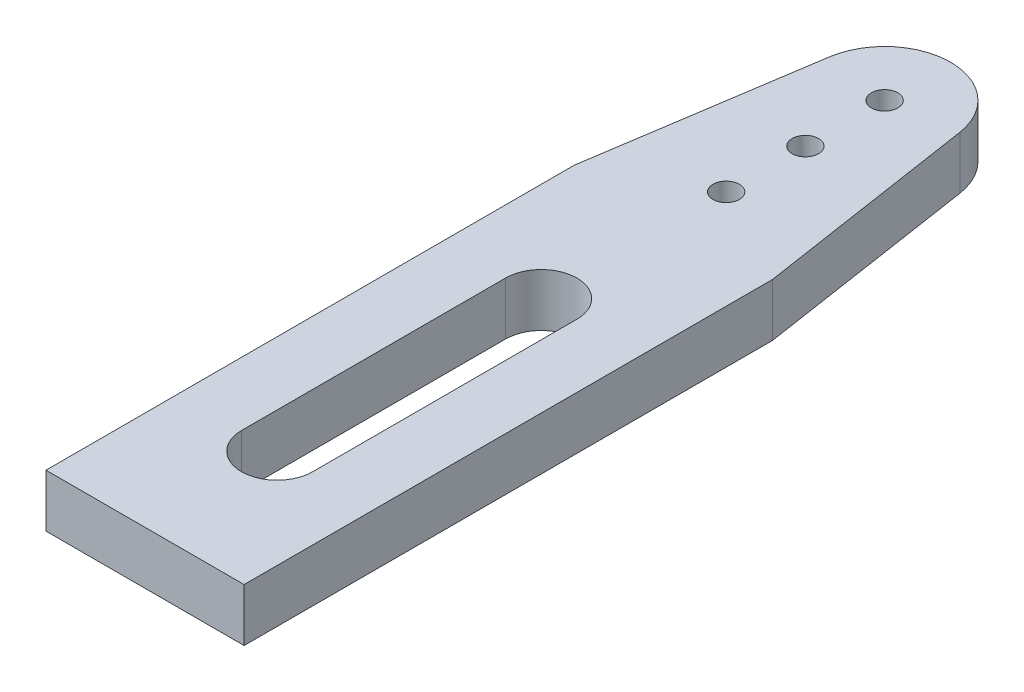
ISO-10303-21;
HEADER;
FILE_DESCRIPTION(('STEP AP214'),'2;1');
FILE_NAME('part.step','',(''),(''),'','','');
FILE_SCHEMA(('AUTOMOTIVE_DESIGN { 1 0 10303 214 1 1 1 1 }'));
ENDSEC;
DATA;
#1=APPLICATION_CONTEXT('core data for automotive mechanical design processes');
#2=APPLICATION_PROTOCOL_DEFINITION('international standard','automotive_design',2000,#1);
#3=PRODUCT_CONTEXT('',#1,'mechanical');
#4=PRODUCT('Part','Part','',(#3));
#5=PRODUCT_RELATED_PRODUCT_CATEGORY('part','',(#4));
#6=PRODUCT_DEFINITION_FORMATION('','',#4);
#7=PRODUCT_DEFINITION_CONTEXT('part definition',#1,'design');
#8=PRODUCT_DEFINITION('design','',#6,#7);
#9=PRODUCT_DEFINITION_SHAPE('','',#8);
#10=(LENGTH_UNIT() NAMED_UNIT(*) SI_UNIT(.MILLI.,.METRE.));
#11=(NAMED_UNIT(*) PLANE_ANGLE_UNIT() SI_UNIT($,.RADIAN.));
#12=(NAMED_UNIT(*) SI_UNIT($,.STERADIAN.) SOLID_ANGLE_UNIT());
#13=UNCERTAINTY_MEASURE_WITH_UNIT(LENGTH_MEASURE(1.E-05),#10,'distance_accuracy_value','');
#14=(GEOMETRIC_REPRESENTATION_CONTEXT(3) GLOBAL_UNCERTAINTY_ASSIGNED_CONTEXT((#13)) GLOBAL_UNIT_ASSIGNED_CONTEXT((#10,
#11,#12)) REPRESENTATION_CONTEXT('',''));
#15=CARTESIAN_POINT('',(0.,0.,0.));
#16=DIRECTION('',(0.,0.,1.));
#17=DIRECTION('',(1.,0.,0.));
#18=AXIS2_PLACEMENT_3D('',#15,#16,#17);
#19=CARTESIAN_POINT('',(0.,2.,-23.));
#20=DIRECTION('',(0.,-1.,0.));
#21=DIRECTION('',(0.,0.,-1.));
#22=AXIS2_PLACEMENT_3D('',#19,#20,#21);
#23=PLANE('',#22);
#24=CARTESIAN_POINT('',(0.,2.,-20.));
#25=DIRECTION('',(0.,1.,0.));
#26=DIRECTION('',(0.,0.,1.));
#27=AXIS2_PLACEMENT_3D('',#24,#25,#26);
#28=CIRCLE('',#27,0.5);
#29=CARTESIAN_POINT('',(0.,2.,-19.5));
#30=VERTEX_POINT('',#29);
#31=EDGE_CURVE('E269',#30,#30,#28,.T.);
#32=ORIENTED_EDGE('',*,*,#31,.F.);
#33=EDGE_LOOP('',(#32));
#34=FACE_BOUND('',#33,.T.);
#35=CARTESIAN_POINT('',(0.,2.,0.));
#36=DIRECTION('',(0.,1.,0.));
#37=DIRECTION('',(0.,0.,1.));
#38=AXIS2_PLACEMENT_3D('',#35,#36,#37);
#39=CIRCLE('',#38,1.35);
#40=CARTESIAN_POINT('',(-1.35,2.,0.));
#41=VERTEX_POINT('',#40);
#42=CARTESIAN_POINT('',(1.35,2.,0.));
#43=VERTEX_POINT('',#42);
#44=EDGE_CURVE('E110',#41,#43,#39,.T.);
#45=ORIENTED_EDGE('',*,*,#44,.F.);
#46=DIRECTION('',(0.,0.,1.));
#47=VECTOR('',#46,1.);
#48=CARTESIAN_POINT('',(-1.35,2.,0.));
#49=LINE('',#48,#47);
#50=CARTESIAN_POINT('',(-1.35,2.,-10.));
#51=VERTEX_POINT('',#50);
#52=EDGE_CURVE('E133',#51,#41,#49,.T.);
#53=ORIENTED_EDGE('',*,*,#52,.F.);
#54=CARTESIAN_POINT('',(0.,2.,-10.));
#55=DIRECTION('',(0.,1.,0.));
#56=DIRECTION('',(0.,0.,1.));
#57=AXIS2_PLACEMENT_3D('',#54,#55,#56);
#58=CIRCLE('',#57,1.35);
#59=CARTESIAN_POINT('',(1.35,2.,-10.));
#60=VERTEX_POINT('',#59);
#61=EDGE_CURVE('E131',#60,#51,#58,.T.);
#62=ORIENTED_EDGE('',*,*,#61,.F.);
#63=DIRECTION('',(0.,0.,-1.));
#64=VECTOR('',#63,1.);
#65=CARTESIAN_POINT('',(1.35,2.,0.));
#66=LINE('',#65,#64);
#67=EDGE_CURVE('E118',#43,#60,#66,.T.);
#68=ORIENTED_EDGE('',*,*,#67,.F.);
#69=EDGE_LOOP('',(#45,#53,#62,#68));
#70=FACE_BOUND('',#69,.T.);
#71=DIRECTION('',(0.,0.,1.));
#72=VECTOR('',#71,1.);
#73=CARTESIAN_POINT('',(-3.75,2.,5.));
#74=LINE('',#73,#72);
#75=CARTESIAN_POINT('',(-3.75,2.,-15.));
#76=VERTEX_POINT('',#75);
#77=CARTESIAN_POINT('',(-3.75,2.,5.));
#78=VERTEX_POINT('',#77);
#79=EDGE_CURVE('E149',#76,#78,#74,.T.);
#80=ORIENTED_EDGE('',*,*,#79,.T.);
#81=DIRECTION('',(1.,0.,0.));
#82=VECTOR('',#81,1.);
#83=CARTESIAN_POINT('',(-3.75,2.,5.));
#84=LINE('',#83,#82);
#85=CARTESIAN_POINT('',(3.75,2.,5.));
#86=VERTEX_POINT('',#85);
#87=EDGE_CURVE('E152',#78,#86,#84,.T.);
#88=ORIENTED_EDGE('',*,*,#87,.T.);
#89=DIRECTION('',(0.,0.,-1.));
#90=VECTOR('',#89,1.);
#91=CARTESIAN_POINT('',(3.75,2.,5.));
#92=LINE('',#91,#90);
#93=CARTESIAN_POINT('',(3.75,2.,-15.));
#94=VERTEX_POINT('',#93);
#95=EDGE_CURVE('E155',#86,#94,#92,.T.);
#96=ORIENTED_EDGE('',*,*,#95,.T.);
#97=DIRECTION('',(-0.150883536989871,0.,-0.988551545578391));
#98=VECTOR('',#97,1.);
#99=CARTESIAN_POINT('',(2.47137886394598,2.,-23.3772088424747));
#100=LINE('',#99,#98);
#101=CARTESIAN_POINT('',(2.47137886394598,2.,-23.3772088424747));
#102=VERTEX_POINT('',#101);
#103=EDGE_CURVE('E157',#94,#102,#100,.T.);
#104=ORIENTED_EDGE('',*,*,#103,.T.);
#105=CARTESIAN_POINT('',(0.,2.,-23.));
#106=DIRECTION('',(0.,1.,0.));
#107=DIRECTION('',(0.,0.,-1.));
#108=AXIS2_PLACEMENT_3D('',#105,#106,#107);
#109=CIRCLE('',#108,2.5);
#110=CARTESIAN_POINT('',(-2.47137886394598,2.,-23.3772088424747));
#111=VERTEX_POINT('',#110);
#112=EDGE_CURVE('E159',#102,#111,#109,.T.);
#113=ORIENTED_EDGE('',*,*,#112,.T.);
#114=DIRECTION('',(-0.150883536989871,0.,0.988551545578391));
#115=VECTOR('',#114,1.);
#116=CARTESIAN_POINT('',(-3.75,2.,-15.));
#117=LINE('',#116,#115);
#118=EDGE_CURVE('E161',#111,#76,#117,.T.);
#119=ORIENTED_EDGE('',*,*,#118,.T.);
#120=EDGE_LOOP('',(#80,#88,#96,#104,#113,#119));
#121=FACE_BOUND('',#120,.T.);
#122=CARTESIAN_POINT('',(0.,2.,-23.));
#123=DIRECTION('',(0.,1.,0.));
#124=DIRECTION('',(0.,0.,1.));
#125=AXIS2_PLACEMENT_3D('',#122,#123,#124);
#126=CIRCLE('',#125,0.5);
#127=CARTESIAN_POINT('',(0.,2.,-22.5));
#128=VERTEX_POINT('',#127);
#129=EDGE_CURVE('E139',#128,#128,#126,.T.);
#130=ORIENTED_EDGE('',*,*,#129,.F.);
#131=EDGE_LOOP('',(#130));
#132=FACE_BOUND('',#131,.T.);
#133=CARTESIAN_POINT('',(0.,2.,-17.));
#134=DIRECTION('',(0.,1.,0.));
#135=DIRECTION('',(0.,0.,1.));
#136=AXIS2_PLACEMENT_3D('',#133,#134,#135);
#137=CIRCLE('',#136,0.5);
#138=CARTESIAN_POINT('',(0.,2.,-16.5));
#139=VERTEX_POINT('',#138);
#140=EDGE_CURVE('E260',#139,#139,#137,.T.);
#141=ORIENTED_EDGE('',*,*,#140,.F.);
#142=EDGE_LOOP('',(#141));
#143=FACE_BOUND('',#142,.T.);
#144=ADVANCED_FACE('F33',(#34,#70,#121,#132,#143),#23,.F.);
#145=CARTESIAN_POINT('',(0.,0.,-23.));
#146=DIRECTION('',(0.,-1.,0.));
#147=DIRECTION('',(0.,0.,-1.));
#148=AXIS2_PLACEMENT_3D('',#145,#146,#147);
#149=PLANE('',#148);
#150=CARTESIAN_POINT('',(0.,0.,-20.));
#151=DIRECTION('',(0.,1.,0.));
#152=DIRECTION('',(0.,0.,1.));
#153=AXIS2_PLACEMENT_3D('',#150,#151,#152);
#154=CIRCLE('',#153,0.5);
#155=CARTESIAN_POINT('',(0.,0.,-19.5));
#156=VERTEX_POINT('',#155);
#157=EDGE_CURVE('E266',#156,#156,#154,.T.);
#158=ORIENTED_EDGE('',*,*,#157,.T.);
#159=EDGE_LOOP('',(#158));
#160=FACE_BOUND('',#159,.T.);
#161=DIRECTION('',(0.,0.,1.));
#162=VECTOR('',#161,1.);
#163=CARTESIAN_POINT('',(-1.35,0.,0.));
#164=LINE('',#163,#162);
#165=CARTESIAN_POINT('',(-1.35,0.,-10.));
#166=VERTEX_POINT('',#165);
#167=CARTESIAN_POINT('',(-1.35,0.,0.));
#168=VERTEX_POINT('',#167);
#169=EDGE_CURVE('E119',#166,#168,#164,.T.);
#170=ORIENTED_EDGE('',*,*,#169,.T.);
#171=CARTESIAN_POINT('',(0.,0.,0.));
#172=DIRECTION('',(0.,1.,0.));
#173=DIRECTION('',(0.,0.,1.));
#174=AXIS2_PLACEMENT_3D('',#171,#172,#173);
#175=CIRCLE('',#174,1.35);
#176=CARTESIAN_POINT('',(1.35,0.,0.));
#177=VERTEX_POINT('',#176);
#178=EDGE_CURVE('E56',#168,#177,#175,.T.);
#179=ORIENTED_EDGE('',*,*,#178,.T.);
#180=DIRECTION('',(0.,0.,-1.));
#181=VECTOR('',#180,1.);
#182=CARTESIAN_POINT('',(1.35,0.,0.));
#183=LINE('',#182,#181);
#184=CARTESIAN_POINT('',(1.35,0.,-10.));
#185=VERTEX_POINT('',#184);
#186=EDGE_CURVE('E125',#177,#185,#183,.T.);
#187=ORIENTED_EDGE('',*,*,#186,.T.);
#188=CARTESIAN_POINT('',(0.,0.,-10.));
#189=DIRECTION('',(0.,1.,0.));
#190=DIRECTION('',(0.,0.,1.));
#191=AXIS2_PLACEMENT_3D('',#188,#189,#190);
#192=CIRCLE('',#191,1.35);
#193=EDGE_CURVE('E141',#185,#166,#192,.T.);
#194=ORIENTED_EDGE('',*,*,#193,.T.);
#195=EDGE_LOOP('',(#170,#179,#187,#194));
#196=FACE_BOUND('',#195,.T.);
#197=DIRECTION('',(0.,0.,1.));
#198=VECTOR('',#197,1.);
#199=CARTESIAN_POINT('',(-3.75,0.,5.));
#200=LINE('',#199,#198);
#201=CARTESIAN_POINT('',(-3.75,0.,-15.));
#202=VERTEX_POINT('',#201);
#203=CARTESIAN_POINT('',(-3.75,0.,5.));
#204=VERTEX_POINT('',#203);
#205=EDGE_CURVE('E126',#202,#204,#200,.T.);
#206=ORIENTED_EDGE('',*,*,#205,.F.);
#207=DIRECTION('',(-0.150883536989871,0.,0.988551545578391));
#208=VECTOR('',#207,1.);
#209=CARTESIAN_POINT('',(-3.75,0.,-15.));
#210=LINE('',#209,#208);
#211=CARTESIAN_POINT('',(-2.47137886394598,0.,-23.3772088424747));
#212=VERTEX_POINT('',#211);
#213=EDGE_CURVE('E153',#212,#202,#210,.T.);
#214=ORIENTED_EDGE('',*,*,#213,.F.);
#215=CARTESIAN_POINT('',(0.,0.,-23.));
#216=DIRECTION('',(0.,1.,0.));
#217=DIRECTION('',(0.,0.,-1.));
#218=AXIS2_PLACEMENT_3D('',#215,#216,#217);
#219=CIRCLE('',#218,2.5);
#220=CARTESIAN_POINT('',(2.47137886394598,0.,-23.3772088424747));
#221=VERTEX_POINT('',#220);
#222=EDGE_CURVE('E172',#221,#212,#219,.T.);
#223=ORIENTED_EDGE('',*,*,#222,.F.);
#224=DIRECTION('',(-0.150883536989871,0.,-0.988551545578391));
#225=VECTOR('',#224,1.);
#226=CARTESIAN_POINT('',(2.47137886394598,0.,-23.3772088424747));
#227=LINE('',#226,#225);
#228=CARTESIAN_POINT('',(3.75,0.,-15.));
#229=VERTEX_POINT('',#228);
#230=EDGE_CURVE('E170',#229,#221,#227,.T.);
#231=ORIENTED_EDGE('',*,*,#230,.F.);
#232=DIRECTION('',(0.,0.,-1.));
#233=VECTOR('',#232,1.);
#234=CARTESIAN_POINT('',(3.75,0.,5.));
#235=LINE('',#234,#233);
#236=CARTESIAN_POINT('',(3.75,0.,5.));
#237=VERTEX_POINT('',#236);
#238=EDGE_CURVE('E168',#237,#229,#235,.T.);
#239=ORIENTED_EDGE('',*,*,#238,.F.);
#240=DIRECTION('',(1.,0.,0.));
#241=VECTOR('',#240,1.);
#242=CARTESIAN_POINT('',(-3.75,0.,5.));
#243=LINE('',#242,#241);
#244=EDGE_CURVE('E166',#204,#237,#243,.T.);
#245=ORIENTED_EDGE('',*,*,#244,.F.);
#246=EDGE_LOOP('',(#206,#214,#223,#231,#239,#245));
#247=FACE_BOUND('',#246,.T.);
#248=CARTESIAN_POINT('',(0.,0.,-23.));
#249=DIRECTION('',(0.,1.,0.));
#250=DIRECTION('',(0.,0.,1.));
#251=AXIS2_PLACEMENT_3D('',#248,#249,#250);
#252=CIRCLE('',#251,0.5);
#253=CARTESIAN_POINT('',(0.,0.,-22.5));
#254=VERTEX_POINT('',#253);
#255=EDGE_CURVE('E272',#254,#254,#252,.T.);
#256=ORIENTED_EDGE('',*,*,#255,.T.);
#257=EDGE_LOOP('',(#256));
#258=FACE_BOUND('',#257,.T.);
#259=CARTESIAN_POINT('',(0.,0.,-17.));
#260=DIRECTION('',(0.,1.,0.));
#261=DIRECTION('',(0.,0.,1.));
#262=AXIS2_PLACEMENT_3D('',#259,#260,#261);
#263=CIRCLE('',#262,0.5);
#264=CARTESIAN_POINT('',(0.,0.,-16.5));
#265=VERTEX_POINT('',#264);
#266=EDGE_CURVE('E263',#265,#265,#263,.T.);
#267=ORIENTED_EDGE('',*,*,#266,.T.);
#268=EDGE_LOOP('',(#267));
#269=FACE_BOUND('',#268,.T.);
#270=ADVANCED_FACE('F196',(#160,#196,#247,#258,#269),#149,.T.);
#271=CARTESIAN_POINT('',(-3.75,2.,5.));
#272=DIRECTION('',(1.,0.,0.));
#273=DIRECTION('',(0.,0.,-1.));
#274=AXIS2_PLACEMENT_3D('',#271,#272,#273);
#275=PLANE('',#274);
#276=ORIENTED_EDGE('',*,*,#205,.T.);
#277=DIRECTION('',(0.,-1.,0.));
#278=VECTOR('',#277,1.);
#279=CARTESIAN_POINT('',(-3.75,2.,5.));
#280=LINE('',#279,#278);
#281=EDGE_CURVE('E11',#78,#204,#280,.T.);
#282=ORIENTED_EDGE('',*,*,#281,.F.);
#283=ORIENTED_EDGE('',*,*,#79,.F.);
#284=DIRECTION('',(0.,-1.,0.));
#285=VECTOR('',#284,1.);
#286=CARTESIAN_POINT('',(-3.75,2.,-15.));
#287=LINE('',#286,#285);
#288=EDGE_CURVE('E163',#76,#202,#287,.T.);
#289=ORIENTED_EDGE('',*,*,#288,.T.);
#290=EDGE_LOOP('',(#276,#282,#283,#289));
#291=FACE_BOUND('',#290,.T.);
#292=ADVANCED_FACE('F35',(#291),#275,.F.);
#293=CARTESIAN_POINT('',(-3.75,2.,5.));
#294=DIRECTION('',(0.,0.,-1.));
#295=DIRECTION('',(-1.,0.,0.));
#296=AXIS2_PLACEMENT_3D('',#293,#294,#295);
#297=PLANE('',#296);
#298=ORIENTED_EDGE('',*,*,#244,.T.);
#299=DIRECTION('',(0.,-1.,0.));
#300=VECTOR('',#299,1.);
#301=CARTESIAN_POINT('',(3.75,2.,5.));
#302=LINE('',#301,#300);
#303=EDGE_CURVE('E41',#86,#237,#302,.T.);
#304=ORIENTED_EDGE('',*,*,#303,.F.);
#305=ORIENTED_EDGE('',*,*,#87,.F.);
#306=ORIENTED_EDGE('',*,*,#281,.T.);
#307=EDGE_LOOP('',(#298,#304,#305,#306));
#308=FACE_BOUND('',#307,.T.);
#309=ADVANCED_FACE('F213',(#308),#297,.F.);
#310=CARTESIAN_POINT('',(3.75,2.,5.));
#311=DIRECTION('',(-1.,0.,0.));
#312=DIRECTION('',(0.,0.,1.));
#313=AXIS2_PLACEMENT_3D('',#310,#311,#312);
#314=PLANE('',#313);
#315=ORIENTED_EDGE('',*,*,#238,.T.);
#316=DIRECTION('',(0.,-1.,0.));
#317=VECTOR('',#316,1.);
#318=CARTESIAN_POINT('',(3.75,2.,-15.));
#319=LINE('',#318,#317);
#320=EDGE_CURVE('E183',#94,#229,#319,.T.);
#321=ORIENTED_EDGE('',*,*,#320,.F.);
#322=ORIENTED_EDGE('',*,*,#95,.F.);
#323=ORIENTED_EDGE('',*,*,#303,.T.);
#324=EDGE_LOOP('',(#315,#321,#322,#323));
#325=FACE_BOUND('',#324,.T.);
#326=ADVANCED_FACE('F190',(#325),#314,.F.);
#327=CARTESIAN_POINT('',(2.47137886394598,2.,-23.3772088424747));
#328=DIRECTION('',(-0.988551545578391,0.,0.150883536989871));
#329=DIRECTION('',(0.150883536989871,0.,0.988551545578391));
#330=AXIS2_PLACEMENT_3D('',#327,#328,#329);
#331=PLANE('',#330);
#332=ORIENTED_EDGE('',*,*,#230,.T.);
#333=DIRECTION('',(0.,-1.,0.));
#334=VECTOR('',#333,1.);
#335=CARTESIAN_POINT('',(2.47137886394598,2.,-23.3772088424747));
#336=LINE('',#335,#334);
#337=EDGE_CURVE('E180',#102,#221,#336,.T.);
#338=ORIENTED_EDGE('',*,*,#337,.F.);
#339=ORIENTED_EDGE('',*,*,#103,.F.);
#340=ORIENTED_EDGE('',*,*,#320,.T.);
#341=EDGE_LOOP('',(#332,#338,#339,#340));
#342=FACE_BOUND('',#341,.T.);
#343=ADVANCED_FACE('F202',(#342),#331,.F.);
#344=CARTESIAN_POINT('',(0.,2.,-23.));
#345=DIRECTION('',(0.,-1.,0.));
#346=DIRECTION('',(0.,0.,-1.));
#347=AXIS2_PLACEMENT_3D('',#344,#345,#346);
#348=CYLINDRICAL_SURFACE('',#347,2.5);
#349=ORIENTED_EDGE('',*,*,#222,.T.);
#350=DIRECTION('',(0.,-1.,0.));
#351=VECTOR('',#350,1.);
#352=CARTESIAN_POINT('',(-2.47137886394598,2.,-23.3772088424747));
#353=LINE('',#352,#351);
#354=EDGE_CURVE('E177',#111,#212,#353,.T.);
#355=ORIENTED_EDGE('',*,*,#354,.F.);
#356=ORIENTED_EDGE('',*,*,#112,.F.);
#357=ORIENTED_EDGE('',*,*,#337,.T.);
#358=EDGE_LOOP('',(#349,#355,#356,#357));
#359=FACE_BOUND('',#358,.T.);
#360=ADVANCED_FACE('F206',(#359),#348,.T.);
#361=CARTESIAN_POINT('',(-3.75,2.,-15.));
#362=DIRECTION('',(0.988551545578391,0.,0.150883536989871));
#363=DIRECTION('',(0.150883536989871,0.,-0.988551545578391));
#364=AXIS2_PLACEMENT_3D('',#361,#362,#363);
#365=PLANE('',#364);
#366=ORIENTED_EDGE('',*,*,#213,.T.);
#367=ORIENTED_EDGE('',*,*,#288,.F.);
#368=ORIENTED_EDGE('',*,*,#118,.F.);
#369=ORIENTED_EDGE('',*,*,#354,.T.);
#370=EDGE_LOOP('',(#366,#367,#368,#369));
#371=FACE_BOUND('',#370,.T.);
#372=ADVANCED_FACE('F216',(#371),#365,.F.);
#373=CARTESIAN_POINT('',(0.,2.,0.));
#374=DIRECTION('',(0.,-1.,0.));
#375=DIRECTION('',(0.,0.,-1.));
#376=AXIS2_PLACEMENT_3D('',#373,#374,#375);
#377=CYLINDRICAL_SURFACE('',#376,1.35);
#378=ORIENTED_EDGE('',*,*,#178,.F.);
#379=DIRECTION('',(0.,-1.,0.));
#380=VECTOR('',#379,1.);
#381=CARTESIAN_POINT('',(-1.35,2.,0.));
#382=LINE('',#381,#380);
#383=EDGE_CURVE('E114',#41,#168,#382,.T.);
#384=ORIENTED_EDGE('',*,*,#383,.F.);
#385=ORIENTED_EDGE('',*,*,#44,.T.);
#386=DIRECTION('',(0.,-1.,0.));
#387=VECTOR('',#386,1.);
#388=CARTESIAN_POINT('',(1.35,2.,0.));
#389=LINE('',#388,#387);
#390=EDGE_CURVE('E113',#43,#177,#389,.T.);
#391=ORIENTED_EDGE('',*,*,#390,.T.);
#392=EDGE_LOOP('',(#378,#384,#385,#391));
#393=FACE_BOUND('',#392,.T.);
#394=ADVANCED_FACE('F112',(#393),#377,.F.);
#395=CARTESIAN_POINT('',(1.35,2.,0.));
#396=DIRECTION('',(-1.,0.,0.));
#397=DIRECTION('',(0.,0.,1.));
#398=AXIS2_PLACEMENT_3D('',#395,#396,#397);
#399=PLANE('',#398);
#400=ORIENTED_EDGE('',*,*,#186,.F.);
#401=ORIENTED_EDGE('',*,*,#390,.F.);
#402=ORIENTED_EDGE('',*,*,#67,.T.);
#403=DIRECTION('',(0.,-1.,0.));
#404=VECTOR('',#403,1.);
#405=CARTESIAN_POINT('',(1.35,2.,-10.));
#406=LINE('',#405,#404);
#407=EDGE_CURVE('E127',#60,#185,#406,.T.);
#408=ORIENTED_EDGE('',*,*,#407,.T.);
#409=EDGE_LOOP('',(#400,#401,#402,#408));
#410=FACE_BOUND('',#409,.T.);
#411=ADVANCED_FACE('F122',(#410),#399,.T.);
#412=CARTESIAN_POINT('',(0.,2.,-10.));
#413=DIRECTION('',(0.,-1.,0.));
#414=DIRECTION('',(0.,0.,-1.));
#415=AXIS2_PLACEMENT_3D('',#412,#413,#414);
#416=CYLINDRICAL_SURFACE('',#415,1.35);
#417=ORIENTED_EDGE('',*,*,#193,.F.);
#418=ORIENTED_EDGE('',*,*,#407,.F.);
#419=ORIENTED_EDGE('',*,*,#61,.T.);
#420=DIRECTION('',(0.,-1.,0.));
#421=VECTOR('',#420,1.);
#422=CARTESIAN_POINT('',(-1.35,2.,-10.));
#423=LINE('',#422,#421);
#424=EDGE_CURVE('E48',#51,#166,#423,.T.);
#425=ORIENTED_EDGE('',*,*,#424,.T.);
#426=EDGE_LOOP('',(#417,#418,#419,#425));
#427=FACE_BOUND('',#426,.T.);
#428=ADVANCED_FACE('F237',(#427),#416,.F.);
#429=CARTESIAN_POINT('',(-1.35,2.,0.));
#430=DIRECTION('',(1.,0.,0.));
#431=DIRECTION('',(0.,0.,-1.));
#432=AXIS2_PLACEMENT_3D('',#429,#430,#431);
#433=PLANE('',#432);
#434=ORIENTED_EDGE('',*,*,#169,.F.);
#435=ORIENTED_EDGE('',*,*,#424,.F.);
#436=ORIENTED_EDGE('',*,*,#52,.T.);
#437=ORIENTED_EDGE('',*,*,#383,.T.);
#438=EDGE_LOOP('',(#434,#435,#436,#437));
#439=FACE_BOUND('',#438,.T.);
#440=ADVANCED_FACE('F240',(#439),#433,.T.);
#441=CARTESIAN_POINT('',(0.,2.,-23.));
#442=DIRECTION('',(0.,-1.,0.));
#443=DIRECTION('',(0.,0.,-1.));
#444=AXIS2_PLACEMENT_3D('',#441,#442,#443);
#445=CYLINDRICAL_SURFACE('',#444,0.5);
#446=ORIENTED_EDGE('',*,*,#129,.T.);
#447=EDGE_LOOP('',(#446));
#448=FACE_BOUND('',#447,.T.);
#449=ORIENTED_EDGE('',*,*,#255,.F.);
#450=EDGE_LOOP('',(#449));
#451=FACE_BOUND('',#450,.T.);
#452=ADVANCED_FACE('F244',(#448,#451),#445,.F.);
#453=CARTESIAN_POINT('',(0.,2.,-20.));
#454=DIRECTION('',(0.,-1.,0.));
#455=DIRECTION('',(0.,0.,-1.));
#456=AXIS2_PLACEMENT_3D('',#453,#454,#455);
#457=CYLINDRICAL_SURFACE('',#456,0.5);
#458=ORIENTED_EDGE('',*,*,#31,.T.);
#459=EDGE_LOOP('',(#458));
#460=FACE_BOUND('',#459,.T.);
#461=ORIENTED_EDGE('',*,*,#157,.F.);
#462=EDGE_LOOP('',(#461));
#463=FACE_BOUND('',#462,.T.);
#464=ADVANCED_FACE('F247',(#460,#463),#457,.F.);
#465=CARTESIAN_POINT('',(0.,2.,-17.));
#466=DIRECTION('',(0.,-1.,0.));
#467=DIRECTION('',(0.,0.,-1.));
#468=AXIS2_PLACEMENT_3D('',#465,#466,#467);
#469=CYLINDRICAL_SURFACE('',#468,0.5);
#470=ORIENTED_EDGE('',*,*,#140,.T.);
#471=EDGE_LOOP('',(#470));
#472=FACE_BOUND('',#471,.T.);
#473=ORIENTED_EDGE('',*,*,#266,.F.);
#474=EDGE_LOOP('',(#473));
#475=FACE_BOUND('',#474,.T.);
#476=ADVANCED_FACE('F251',(#472,#475),#469,.F.);
#477=CLOSED_SHELL('',(#144,#270,#292,#309,#326,#343,#360,#372,#394,#411,#428,#440,#452,#464,#476));
#478=MANIFOLD_SOLID_BREP('B2',#477);
#479=ADVANCED_BREP_SHAPE_REPRESENTATION('',(#18,#478),#14);
#480=SHAPE_DEFINITION_REPRESENTATION(#9,#479);
ENDSEC;
END-ISO-10303-21;
